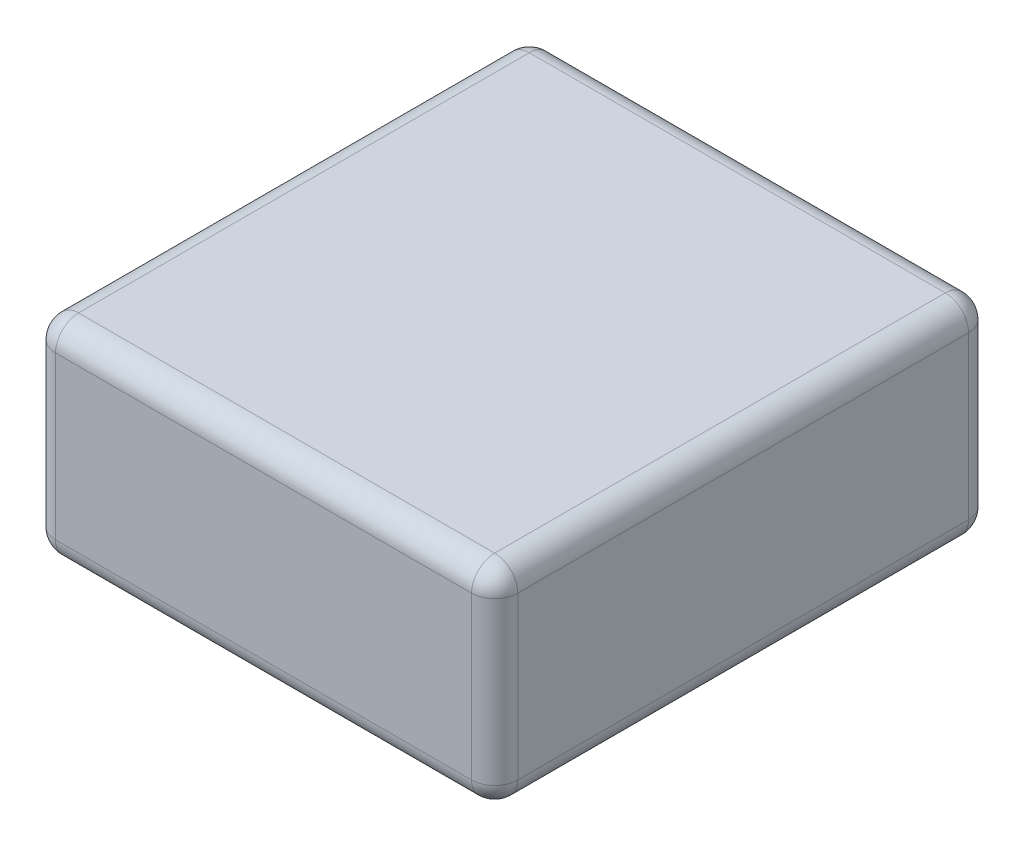
ISO-10303-21;
HEADER;
FILE_DESCRIPTION(('STEP AP214'),'2;1');
FILE_NAME('part.step','',(''),(''),'','','');
FILE_SCHEMA(('AUTOMOTIVE_DESIGN { 1 0 10303 214 1 1 1 1 }'));
ENDSEC;
DATA;
#1=APPLICATION_CONTEXT('core data for automotive mechanical design processes');
#2=APPLICATION_PROTOCOL_DEFINITION('international standard','automotive_design',2000,#1);
#3=PRODUCT_CONTEXT('',#1,'mechanical');
#4=PRODUCT('Part','Part','',(#3));
#5=PRODUCT_RELATED_PRODUCT_CATEGORY('part','',(#4));
#6=PRODUCT_DEFINITION_FORMATION('','',#4);
#7=PRODUCT_DEFINITION_CONTEXT('part definition',#1,'design');
#8=PRODUCT_DEFINITION('design','',#6,#7);
#9=PRODUCT_DEFINITION_SHAPE('','',#8);
#10=(LENGTH_UNIT() NAMED_UNIT(*) SI_UNIT(.MILLI.,.METRE.));
#11=(NAMED_UNIT(*) PLANE_ANGLE_UNIT() SI_UNIT($,.RADIAN.));
#12=(NAMED_UNIT(*) SI_UNIT($,.STERADIAN.) SOLID_ANGLE_UNIT());
#13=UNCERTAINTY_MEASURE_WITH_UNIT(LENGTH_MEASURE(1.E-05),#10,'distance_accuracy_value','');
#14=(GEOMETRIC_REPRESENTATION_CONTEXT(3) GLOBAL_UNCERTAINTY_ASSIGNED_CONTEXT((#13)) GLOBAL_UNIT_ASSIGNED_CONTEXT((#10,
#11,#12)) REPRESENTATION_CONTEXT('',''));
#15=CARTESIAN_POINT('',(0.,0.,0.));
#16=DIRECTION('',(0.,0.,1.));
#17=DIRECTION('',(1.,0.,0.));
#18=AXIS2_PLACEMENT_3D('',#15,#16,#17);
#19=CARTESIAN_POINT('',(100.,45.,-215.));
#20=DIRECTION('',(1.,0.,0.));
#21=DIRECTION('',(0.,0.,-1.));
#22=AXIS2_PLACEMENT_3D('',#19,#20,#21);
#23=PLANE('',#22);
#24=DIRECTION('',(0.,0.,1.));
#25=VECTOR('',#24,1.);
#26=CARTESIAN_POINT('',(100.,-35.,-215.));
#27=LINE('',#26,#25);
#28=CARTESIAN_POINT('',(100.,-35.,-10.));
#29=VERTEX_POINT('',#28);
#30=CARTESIAN_POINT('',(100.,-35.,-205.));
#31=VERTEX_POINT('',#30);
#32=EDGE_CURVE('E161',#29,#31,#27,.F.);
#33=ORIENTED_EDGE('',*,*,#32,.T.);
#34=DIRECTION('',(0.,1.,0.));
#35=VECTOR('',#34,1.);
#36=CARTESIAN_POINT('',(100.,45.,-205.));
#37=LINE('',#36,#35);
#38=CARTESIAN_POINT('',(100.,35.,-205.));
#39=VERTEX_POINT('',#38);
#40=EDGE_CURVE('E298',#31,#39,#37,.T.);
#41=ORIENTED_EDGE('',*,*,#40,.T.);
#42=DIRECTION('',(0.,0.,1.));
#43=VECTOR('',#42,1.);
#44=CARTESIAN_POINT('',(100.,35.,-215.));
#45=LINE('',#44,#43);
#46=CARTESIAN_POINT('',(100.,35.,-10.));
#47=VERTEX_POINT('',#46);
#48=EDGE_CURVE('E290',#39,#47,#45,.T.);
#49=ORIENTED_EDGE('',*,*,#48,.T.);
#50=DIRECTION('',(0.,1.,0.));
#51=VECTOR('',#50,1.);
#52=CARTESIAN_POINT('',(100.,45.,-10.));
#53=LINE('',#52,#51);
#54=EDGE_CURVE('E292',#47,#29,#53,.F.);
#55=ORIENTED_EDGE('',*,*,#54,.T.);
#56=EDGE_LOOP('',(#33,#41,#49,#55));
#57=FACE_BOUND('',#56,.T.);
#58=ADVANCED_FACE('F41',(#57),#23,.T.);
#59=CARTESIAN_POINT('',(-100.,-45.,-215.));
#60=DIRECTION('',(0.,-1.,0.));
#61=DIRECTION('',(0.,0.,-1.));
#62=AXIS2_PLACEMENT_3D('',#59,#60,#61);
#63=PLANE('',#62);
#64=DIRECTION('',(0.,0.,1.));
#65=VECTOR('',#64,1.);
#66=CARTESIAN_POINT('',(-90.,-45.,-215.));
#67=LINE('',#66,#65);
#68=CARTESIAN_POINT('',(-90.,-45.,-10.));
#69=VERTEX_POINT('',#68);
#70=CARTESIAN_POINT('',(-90.,-45.,-205.));
#71=VERTEX_POINT('',#70);
#72=EDGE_CURVE('E139',#69,#71,#67,.F.);
#73=ORIENTED_EDGE('',*,*,#72,.T.);
#74=DIRECTION('',(1.,0.,0.));
#75=VECTOR('',#74,1.);
#76=CARTESIAN_POINT('',(100.,-45.,-205.));
#77=LINE('',#76,#75);
#78=CARTESIAN_POINT('',(90.,-45.,-205.));
#79=VERTEX_POINT('',#78);
#80=EDGE_CURVE('E135',#71,#79,#77,.T.);
#81=ORIENTED_EDGE('',*,*,#80,.T.);
#82=DIRECTION('',(0.,0.,1.));
#83=VECTOR('',#82,1.);
#84=CARTESIAN_POINT('',(90.,-45.,-215.));
#85=LINE('',#84,#83);
#86=CARTESIAN_POINT('',(90.,-45.,-10.));
#87=VERTEX_POINT('',#86);
#88=EDGE_CURVE('E129',#79,#87,#85,.T.);
#89=ORIENTED_EDGE('',*,*,#88,.T.);
#90=DIRECTION('',(1.,0.,0.));
#91=VECTOR('',#90,1.);
#92=CARTESIAN_POINT('',(-100.,-45.,-10.));
#93=LINE('',#92,#91);
#94=EDGE_CURVE('E132',#87,#69,#93,.F.);
#95=ORIENTED_EDGE('',*,*,#94,.T.);
#96=EDGE_LOOP('',(#73,#81,#89,#95));
#97=FACE_BOUND('',#96,.T.);
#98=ADVANCED_FACE('F131',(#97),#63,.T.);
#99=CARTESIAN_POINT('',(-100.,45.,-215.));
#100=DIRECTION('',(-1.,0.,0.));
#101=DIRECTION('',(0.,-1.,0.));
#102=AXIS2_PLACEMENT_3D('',#99,#100,#101);
#103=PLANE('',#102);
#104=DIRECTION('',(0.,-1.,0.));
#105=VECTOR('',#104,1.);
#106=CARTESIAN_POINT('',(-100.,-45.,-205.));
#107=LINE('',#106,#105);
#108=CARTESIAN_POINT('',(-100.,35.,-205.));
#109=VERTEX_POINT('',#108);
#110=CARTESIAN_POINT('',(-100.,-35.,-205.));
#111=VERTEX_POINT('',#110);
#112=EDGE_CURVE('E238',#109,#111,#107,.T.);
#113=ORIENTED_EDGE('',*,*,#112,.T.);
#114=DIRECTION('',(0.,0.,1.));
#115=VECTOR('',#114,1.);
#116=CARTESIAN_POINT('',(-100.,-35.,-215.));
#117=LINE('',#116,#115);
#118=CARTESIAN_POINT('',(-100.,-35.,-10.));
#119=VERTEX_POINT('',#118);
#120=EDGE_CURVE('E245',#111,#119,#117,.T.);
#121=ORIENTED_EDGE('',*,*,#120,.T.);
#122=DIRECTION('',(0.,-1.,0.));
#123=VECTOR('',#122,1.);
#124=CARTESIAN_POINT('',(-100.,45.,-10.));
#125=LINE('',#124,#123);
#126=CARTESIAN_POINT('',(-100.,35.,-10.));
#127=VERTEX_POINT('',#126);
#128=EDGE_CURVE('E246',#119,#127,#125,.F.);
#129=ORIENTED_EDGE('',*,*,#128,.T.);
#130=DIRECTION('',(0.,0.,1.));
#131=VECTOR('',#130,1.);
#132=CARTESIAN_POINT('',(-100.,35.,-215.));
#133=LINE('',#132,#131);
#134=EDGE_CURVE('E250',#127,#109,#133,.F.);
#135=ORIENTED_EDGE('',*,*,#134,.T.);
#136=EDGE_LOOP('',(#113,#121,#129,#135));
#137=FACE_BOUND('',#136,.T.);
#138=ADVANCED_FACE('F300',(#137),#103,.T.);
#139=CARTESIAN_POINT('',(-100.,45.,-215.));
#140=DIRECTION('',(0.,1.,0.));
#141=DIRECTION('',(0.,0.,1.));
#142=AXIS2_PLACEMENT_3D('',#139,#140,#141);
#143=PLANE('',#142);
#144=DIRECTION('',(-1.,0.,0.));
#145=VECTOR('',#144,1.);
#146=CARTESIAN_POINT('',(-100.,45.,-205.));
#147=LINE('',#146,#145);
#148=CARTESIAN_POINT('',(90.,45.,-205.));
#149=VERTEX_POINT('',#148);
#150=CARTESIAN_POINT('',(-90.,45.,-205.));
#151=VERTEX_POINT('',#150);
#152=EDGE_CURVE('E50',#149,#151,#147,.T.);
#153=ORIENTED_EDGE('',*,*,#152,.T.);
#154=DIRECTION('',(0.,0.,1.));
#155=VECTOR('',#154,1.);
#156=CARTESIAN_POINT('',(-90.,45.,-215.));
#157=LINE('',#156,#155);
#158=CARTESIAN_POINT('',(-90.,45.,-10.));
#159=VERTEX_POINT('',#158);
#160=EDGE_CURVE('E11',#151,#159,#157,.T.);
#161=ORIENTED_EDGE('',*,*,#160,.T.);
#162=DIRECTION('',(-1.,0.,0.));
#163=VECTOR('',#162,1.);
#164=CARTESIAN_POINT('',(-100.,45.,-10.));
#165=LINE('',#164,#163);
#166=CARTESIAN_POINT('',(90.,45.,-10.));
#167=VERTEX_POINT('',#166);
#168=EDGE_CURVE('E217',#159,#167,#165,.F.);
#169=ORIENTED_EDGE('',*,*,#168,.T.);
#170=DIRECTION('',(0.,0.,1.));
#171=VECTOR('',#170,1.);
#172=CARTESIAN_POINT('',(90.,45.,-215.));
#173=LINE('',#172,#171);
#174=EDGE_CURVE('E61',#167,#149,#173,.F.);
#175=ORIENTED_EDGE('',*,*,#174,.T.);
#176=EDGE_LOOP('',(#153,#161,#169,#175));
#177=FACE_BOUND('',#176,.T.);
#178=ADVANCED_FACE('F220',(#177),#143,.T.);
#179=CARTESIAN_POINT('',(0.,0.,-215.));
#180=DIRECTION('',(0.,0.,1.));
#181=DIRECTION('',(1.,0.,0.));
#182=AXIS2_PLACEMENT_3D('',#179,#180,#181);
#183=PLANE('',#182);
#184=DIRECTION('',(0.,1.,0.));
#185=VECTOR('',#184,1.);
#186=CARTESIAN_POINT('',(90.,-45.,-215.));
#187=LINE('',#186,#185);
#188=CARTESIAN_POINT('',(90.,35.,-215.));
#189=VERTEX_POINT('',#188);
#190=CARTESIAN_POINT('',(90.,-35.,-215.));
#191=VERTEX_POINT('',#190);
#192=EDGE_CURVE('E281',#189,#191,#187,.F.);
#193=ORIENTED_EDGE('',*,*,#192,.T.);
#194=DIRECTION('',(1.,0.,0.));
#195=VECTOR('',#194,1.);
#196=CARTESIAN_POINT('',(-100.,-35.,-215.));
#197=LINE('',#196,#195);
#198=CARTESIAN_POINT('',(-90.,-35.,-215.));
#199=VERTEX_POINT('',#198);
#200=EDGE_CURVE('E284',#191,#199,#197,.F.);
#201=ORIENTED_EDGE('',*,*,#200,.T.);
#202=DIRECTION('',(0.,-1.,0.));
#203=VECTOR('',#202,1.);
#204=CARTESIAN_POINT('',(-90.,45.,-215.));
#205=LINE('',#204,#203);
#206=CARTESIAN_POINT('',(-90.,35.,-215.));
#207=VERTEX_POINT('',#206);
#208=EDGE_CURVE('E278',#199,#207,#205,.F.);
#209=ORIENTED_EDGE('',*,*,#208,.T.);
#210=DIRECTION('',(-1.,0.,0.));
#211=VECTOR('',#210,1.);
#212=CARTESIAN_POINT('',(100.,35.,-215.));
#213=LINE('',#212,#211);
#214=EDGE_CURVE('E231',#207,#189,#213,.F.);
#215=ORIENTED_EDGE('',*,*,#214,.T.);
#216=EDGE_LOOP('',(#193,#201,#209,#215));
#217=FACE_BOUND('',#216,.T.);
#218=ADVANCED_FACE('F285',(#217),#183,.F.);
#219=CARTESIAN_POINT('',(0.,0.,0.));
#220=DIRECTION('',(0.,0.,1.));
#221=DIRECTION('',(1.,0.,0.));
#222=AXIS2_PLACEMENT_3D('',#219,#220,#221);
#223=PLANE('',#222);
#224=DIRECTION('',(0.,-1.,0.));
#225=VECTOR('',#224,1.);
#226=CARTESIAN_POINT('',(-90.,0.,0.));
#227=LINE('',#226,#225);
#228=CARTESIAN_POINT('',(-90.,35.,0.));
#229=VERTEX_POINT('',#228);
#230=CARTESIAN_POINT('',(-90.,-35.,0.));
#231=VERTEX_POINT('',#230);
#232=EDGE_CURVE('E257',#229,#231,#227,.T.);
#233=ORIENTED_EDGE('',*,*,#232,.T.);
#234=DIRECTION('',(1.,0.,0.));
#235=VECTOR('',#234,1.);
#236=CARTESIAN_POINT('',(0.,-35.,0.));
#237=LINE('',#236,#235);
#238=CARTESIAN_POINT('',(90.,-35.,0.));
#239=VERTEX_POINT('',#238);
#240=EDGE_CURVE('E218',#231,#239,#237,.T.);
#241=ORIENTED_EDGE('',*,*,#240,.T.);
#242=DIRECTION('',(0.,1.,0.));
#243=VECTOR('',#242,1.);
#244=CARTESIAN_POINT('',(90.,0.,0.));
#245=LINE('',#244,#243);
#246=CARTESIAN_POINT('',(90.,35.,0.));
#247=VERTEX_POINT('',#246);
#248=EDGE_CURVE('E255',#239,#247,#245,.T.);
#249=ORIENTED_EDGE('',*,*,#248,.T.);
#250=DIRECTION('',(-1.,0.,0.));
#251=VECTOR('',#250,1.);
#252=CARTESIAN_POINT('',(0.,35.,0.));
#253=LINE('',#252,#251);
#254=EDGE_CURVE('E248',#247,#229,#253,.T.);
#255=ORIENTED_EDGE('',*,*,#254,.T.);
#256=EDGE_LOOP('',(#233,#241,#249,#255));
#257=FACE_BOUND('',#256,.T.);
#258=ADVANCED_FACE('F306',(#257),#223,.T.);
#259=CARTESIAN_POINT('',(0.,35.,-10.));
#260=DIRECTION('',(-1.,0.,0.));
#261=DIRECTION('',(0.,0.,1.));
#262=AXIS2_PLACEMENT_3D('',#259,#260,#261);
#263=CYLINDRICAL_SURFACE('',#262,10.);
#264=CARTESIAN_POINT('',(-90.,35.,-10.));
#265=DIRECTION('',(-1.,0.,0.));
#266=DIRECTION('',(0.,0.,1.));
#267=AXIS2_PLACEMENT_3D('',#264,#265,#266);
#268=CIRCLE('',#267,10.);
#269=EDGE_CURVE('E45',#229,#159,#268,.T.);
#270=ORIENTED_EDGE('',*,*,#269,.F.);
#271=ORIENTED_EDGE('',*,*,#254,.F.);
#272=CARTESIAN_POINT('',(90.,35.,-10.));
#273=DIRECTION('',(1.,0.,0.));
#274=DIRECTION('',(0.,0.,-1.));
#275=AXIS2_PLACEMENT_3D('',#272,#273,#274);
#276=CIRCLE('',#275,10.);
#277=EDGE_CURVE('E200',#167,#247,#276,.T.);
#278=ORIENTED_EDGE('',*,*,#277,.F.);
#279=ORIENTED_EDGE('',*,*,#168,.F.);
#280=EDGE_LOOP('',(#270,#271,#278,#279));
#281=FACE_BOUND('',#280,.T.);
#282=ADVANCED_FACE('F43',(#281),#263,.T.);
#283=CARTESIAN_POINT('',(-90.,35.,-10.));
#284=DIRECTION('',(0.,1.,0.));
#285=DIRECTION('',(0.,0.,1.));
#286=AXIS2_PLACEMENT_3D('',#283,#284,#285);
#287=SPHERICAL_SURFACE('',#286,10.);
#288=CARTESIAN_POINT('',(-90.,35.,-10.));
#289=DIRECTION('',(0.,1.,0.));
#290=DIRECTION('',(0.,0.,1.));
#291=AXIS2_PLACEMENT_3D('',#288,#289,#290);
#292=CIRCLE('',#291,10.);
#293=EDGE_CURVE('E196',#229,#127,#292,.F.);
#294=ORIENTED_EDGE('',*,*,#293,.F.);
#295=ORIENTED_EDGE('',*,*,#269,.T.);
#296=CARTESIAN_POINT('',(-90.,35.,-10.));
#297=DIRECTION('',(0.,0.,1.));
#298=DIRECTION('',(1.,0.,0.));
#299=AXIS2_PLACEMENT_3D('',#296,#297,#298);
#300=CIRCLE('',#299,10.);
#301=EDGE_CURVE('E199',#127,#159,#300,.F.);
#302=ORIENTED_EDGE('',*,*,#301,.F.);
#303=EDGE_LOOP('',(#294,#295,#302));
#304=FACE_BOUND('',#303,.T.);
#305=ADVANCED_FACE('F212',(#304),#287,.T.);
#306=CARTESIAN_POINT('',(90.,35.,-10.));
#307=DIRECTION('',(0.,0.,1.));
#308=DIRECTION('',(1.,0.,0.));
#309=AXIS2_PLACEMENT_3D('',#306,#307,#308);
#310=SPHERICAL_SURFACE('',#309,10.);
#311=CARTESIAN_POINT('',(90.,35.,-10.));
#312=DIRECTION('',(0.,0.,1.));
#313=DIRECTION('',(1.,0.,0.));
#314=AXIS2_PLACEMENT_3D('',#311,#312,#313);
#315=CIRCLE('',#314,10.);
#316=EDGE_CURVE('E190',#167,#47,#315,.F.);
#317=ORIENTED_EDGE('',*,*,#316,.F.);
#318=ORIENTED_EDGE('',*,*,#277,.T.);
#319=CARTESIAN_POINT('',(90.,35.,-10.));
#320=DIRECTION('',(0.,1.,0.));
#321=DIRECTION('',(0.,0.,1.));
#322=AXIS2_PLACEMENT_3D('',#319,#320,#321);
#323=CIRCLE('',#322,10.);
#324=EDGE_CURVE('E193',#47,#247,#323,.F.);
#325=ORIENTED_EDGE('',*,*,#324,.F.);
#326=EDGE_LOOP('',(#317,#318,#325));
#327=FACE_BOUND('',#326,.T.);
#328=ADVANCED_FACE('F310',(#327),#310,.T.);
#329=CARTESIAN_POINT('',(-90.,35.,-215.));
#330=DIRECTION('',(0.,0.,1.));
#331=DIRECTION('',(1.,0.,0.));
#332=AXIS2_PLACEMENT_3D('',#329,#330,#331);
#333=CYLINDRICAL_SURFACE('',#332,10.);
#334=ORIENTED_EDGE('',*,*,#301,.T.);
#335=ORIENTED_EDGE('',*,*,#160,.F.);
#336=CARTESIAN_POINT('',(-90.,35.,-205.));
#337=DIRECTION('',(0.,0.,-1.));
#338=DIRECTION('',(-1.,0.,0.));
#339=AXIS2_PLACEMENT_3D('',#336,#337,#338);
#340=CIRCLE('',#339,10.);
#341=EDGE_CURVE('E184',#109,#151,#340,.T.);
#342=ORIENTED_EDGE('',*,*,#341,.F.);
#343=ORIENTED_EDGE('',*,*,#134,.F.);
#344=EDGE_LOOP('',(#334,#335,#342,#343));
#345=FACE_BOUND('',#344,.T.);
#346=ADVANCED_FACE('F224',(#345),#333,.T.);
#347=CARTESIAN_POINT('',(-90.,0.,-10.));
#348=DIRECTION('',(0.,-1.,0.));
#349=DIRECTION('',(1.,0.,0.));
#350=AXIS2_PLACEMENT_3D('',#347,#348,#349);
#351=CYLINDRICAL_SURFACE('',#350,10.);
#352=ORIENTED_EDGE('',*,*,#293,.T.);
#353=ORIENTED_EDGE('',*,*,#128,.F.);
#354=CARTESIAN_POINT('',(-90.,-35.,-10.));
#355=DIRECTION('',(0.,-1.,0.));
#356=DIRECTION('',(1.,0.,0.));
#357=AXIS2_PLACEMENT_3D('',#354,#355,#356);
#358=CIRCLE('',#357,10.);
#359=EDGE_CURVE('E181',#231,#119,#358,.T.);
#360=ORIENTED_EDGE('',*,*,#359,.F.);
#361=ORIENTED_EDGE('',*,*,#232,.F.);
#362=EDGE_LOOP('',(#352,#353,#360,#361));
#363=FACE_BOUND('',#362,.T.);
#364=ADVANCED_FACE('F304',(#363),#351,.T.);
#365=CARTESIAN_POINT('',(0.,-35.,-10.));
#366=DIRECTION('',(1.,0.,0.));
#367=DIRECTION('',(0.,0.,-1.));
#368=AXIS2_PLACEMENT_3D('',#365,#366,#367);
#369=CYLINDRICAL_SURFACE('',#368,10.);
#370=CARTESIAN_POINT('',(90.,-35.,-10.));
#371=DIRECTION('',(1.,0.,0.));
#372=DIRECTION('',(0.,1.,0.));
#373=AXIS2_PLACEMENT_3D('',#370,#371,#372);
#374=CIRCLE('',#373,10.);
#375=EDGE_CURVE('E146',#239,#87,#374,.T.);
#376=ORIENTED_EDGE('',*,*,#375,.F.);
#377=ORIENTED_EDGE('',*,*,#240,.F.);
#378=CARTESIAN_POINT('',(-90.,-35.,-10.));
#379=DIRECTION('',(-1.,0.,0.));
#380=DIRECTION('',(0.,0.,1.));
#381=AXIS2_PLACEMENT_3D('',#378,#379,#380);
#382=CIRCLE('',#381,10.);
#383=EDGE_CURVE('E149',#69,#231,#382,.T.);
#384=ORIENTED_EDGE('',*,*,#383,.F.);
#385=ORIENTED_EDGE('',*,*,#94,.F.);
#386=EDGE_LOOP('',(#376,#377,#384,#385));
#387=FACE_BOUND('',#386,.T.);
#388=ADVANCED_FACE('F144',(#387),#369,.T.);
#389=CARTESIAN_POINT('',(90.,0.,-10.));
#390=DIRECTION('',(0.,1.,0.));
#391=DIRECTION('',(0.,0.,1.));
#392=AXIS2_PLACEMENT_3D('',#389,#390,#391);
#393=CYLINDRICAL_SURFACE('',#392,10.);
#394=ORIENTED_EDGE('',*,*,#324,.T.);
#395=ORIENTED_EDGE('',*,*,#248,.F.);
#396=CARTESIAN_POINT('',(90.,-35.,-10.));
#397=DIRECTION('',(0.,-1.,0.));
#398=DIRECTION('',(0.,0.,-1.));
#399=AXIS2_PLACEMENT_3D('',#396,#397,#398);
#400=CIRCLE('',#399,10.);
#401=EDGE_CURVE('E158',#29,#239,#400,.T.);
#402=ORIENTED_EDGE('',*,*,#401,.F.);
#403=ORIENTED_EDGE('',*,*,#54,.F.);
#404=EDGE_LOOP('',(#394,#395,#402,#403));
#405=FACE_BOUND('',#404,.T.);
#406=ADVANCED_FACE('F308',(#405),#393,.T.);
#407=CARTESIAN_POINT('',(90.,35.,-215.));
#408=DIRECTION('',(0.,0.,1.));
#409=DIRECTION('',(1.,0.,0.));
#410=AXIS2_PLACEMENT_3D('',#407,#408,#409);
#411=CYLINDRICAL_SURFACE('',#410,10.);
#412=ORIENTED_EDGE('',*,*,#316,.T.);
#413=ORIENTED_EDGE('',*,*,#48,.F.);
#414=CARTESIAN_POINT('',(90.,35.,-205.));
#415=DIRECTION('',(0.,0.,-1.));
#416=DIRECTION('',(-1.,0.,0.));
#417=AXIS2_PLACEMENT_3D('',#414,#415,#416);
#418=CIRCLE('',#417,10.);
#419=EDGE_CURVE('E176',#149,#39,#418,.T.);
#420=ORIENTED_EDGE('',*,*,#419,.F.);
#421=ORIENTED_EDGE('',*,*,#174,.F.);
#422=EDGE_LOOP('',(#412,#413,#420,#421));
#423=FACE_BOUND('',#422,.T.);
#424=ADVANCED_FACE('F313',(#423),#411,.T.);
#425=CARTESIAN_POINT('',(-100.,35.,-205.));
#426=DIRECTION('',(1.,0.,0.));
#427=DIRECTION('',(0.,0.,-1.));
#428=AXIS2_PLACEMENT_3D('',#425,#426,#427);
#429=CYLINDRICAL_SURFACE('',#428,10.);
#430=CARTESIAN_POINT('',(-90.,35.,-205.));
#431=DIRECTION('',(-1.,0.,0.));
#432=DIRECTION('',(0.,0.,1.));
#433=AXIS2_PLACEMENT_3D('',#430,#431,#432);
#434=CIRCLE('',#433,10.);
#435=EDGE_CURVE('E187',#151,#207,#434,.T.);
#436=ORIENTED_EDGE('',*,*,#435,.F.);
#437=ORIENTED_EDGE('',*,*,#152,.F.);
#438=CARTESIAN_POINT('',(90.,35.,-205.));
#439=DIRECTION('',(1.,0.,0.));
#440=DIRECTION('',(0.,0.,-1.));
#441=AXIS2_PLACEMENT_3D('',#438,#439,#440);
#442=CIRCLE('',#441,10.);
#443=EDGE_CURVE('E173',#189,#149,#442,.T.);
#444=ORIENTED_EDGE('',*,*,#443,.F.);
#445=ORIENTED_EDGE('',*,*,#214,.F.);
#446=EDGE_LOOP('',(#436,#437,#444,#445));
#447=FACE_BOUND('',#446,.T.);
#448=ADVANCED_FACE('F228',(#447),#429,.T.);
#449=CARTESIAN_POINT('',(-90.,35.,-205.));
#450=DIRECTION('',(0.,1.,0.));
#451=DIRECTION('',(0.,0.,1.));
#452=AXIS2_PLACEMENT_3D('',#449,#450,#451);
#453=SPHERICAL_SURFACE('',#452,10.);
#454=ORIENTED_EDGE('',*,*,#341,.T.);
#455=ORIENTED_EDGE('',*,*,#435,.T.);
#456=CARTESIAN_POINT('',(-90.,35.,-205.));
#457=DIRECTION('',(0.,1.,0.));
#458=DIRECTION('',(0.,0.,1.));
#459=AXIS2_PLACEMENT_3D('',#456,#457,#458);
#460=CIRCLE('',#459,10.);
#461=EDGE_CURVE('E165',#109,#207,#460,.F.);
#462=ORIENTED_EDGE('',*,*,#461,.F.);
#463=EDGE_LOOP('',(#454,#455,#462));
#464=FACE_BOUND('',#463,.T.);
#465=ADVANCED_FACE('F233',(#464),#453,.T.);
#466=CARTESIAN_POINT('',(-90.,-35.,-10.));
#467=DIRECTION('',(0.,0.,1.));
#468=DIRECTION('',(1.,0.,0.));
#469=AXIS2_PLACEMENT_3D('',#466,#467,#468);
#470=SPHERICAL_SURFACE('',#469,10.);
#471=ORIENTED_EDGE('',*,*,#383,.T.);
#472=ORIENTED_EDGE('',*,*,#359,.T.);
#473=CARTESIAN_POINT('',(-90.,-35.,-10.));
#474=DIRECTION('',(0.,0.,1.));
#475=DIRECTION('',(1.,0.,0.));
#476=AXIS2_PLACEMENT_3D('',#473,#474,#475);
#477=CIRCLE('',#476,10.);
#478=EDGE_CURVE('E162',#69,#119,#477,.F.);
#479=ORIENTED_EDGE('',*,*,#478,.F.);
#480=EDGE_LOOP('',(#471,#472,#479));
#481=FACE_BOUND('',#480,.T.);
#482=ADVANCED_FACE('F330',(#481),#470,.T.);
#483=CARTESIAN_POINT('',(90.,-35.,-10.));
#484=DIRECTION('',(0.,0.,1.));
#485=DIRECTION('',(1.,0.,0.));
#486=AXIS2_PLACEMENT_3D('',#483,#484,#485);
#487=SPHERICAL_SURFACE('',#486,10.);
#488=ORIENTED_EDGE('',*,*,#401,.T.);
#489=ORIENTED_EDGE('',*,*,#375,.T.);
#490=CARTESIAN_POINT('',(90.,-35.,-10.));
#491=DIRECTION('',(0.,0.,1.));
#492=DIRECTION('',(1.,0.,0.));
#493=AXIS2_PLACEMENT_3D('',#490,#491,#492);
#494=CIRCLE('',#493,10.);
#495=EDGE_CURVE('E155',#29,#87,#494,.F.);
#496=ORIENTED_EDGE('',*,*,#495,.F.);
#497=EDGE_LOOP('',(#488,#489,#496));
#498=FACE_BOUND('',#497,.T.);
#499=ADVANCED_FACE('F154',(#498),#487,.T.);
#500=CARTESIAN_POINT('',(90.,35.,-205.));
#501=DIRECTION('',(0.,1.,0.));
#502=DIRECTION('',(0.,0.,1.));
#503=AXIS2_PLACEMENT_3D('',#500,#501,#502);
#504=SPHERICAL_SURFACE('',#503,10.);
#505=ORIENTED_EDGE('',*,*,#443,.T.);
#506=ORIENTED_EDGE('',*,*,#419,.T.);
#507=CARTESIAN_POINT('',(90.,35.,-205.));
#508=DIRECTION('',(0.,1.,0.));
#509=DIRECTION('',(0.,0.,1.));
#510=AXIS2_PLACEMENT_3D('',#507,#508,#509);
#511=CIRCLE('',#510,10.);
#512=EDGE_CURVE('E163',#189,#39,#511,.F.);
#513=ORIENTED_EDGE('',*,*,#512,.F.);
#514=EDGE_LOOP('',(#505,#506,#513));
#515=FACE_BOUND('',#514,.T.);
#516=ADVANCED_FACE('F316',(#515),#504,.T.);
#517=CARTESIAN_POINT('',(-90.,45.,-205.));
#518=DIRECTION('',(0.,1.,0.));
#519=DIRECTION('',(-1.,0.,0.));
#520=AXIS2_PLACEMENT_3D('',#517,#518,#519);
#521=CYLINDRICAL_SURFACE('',#520,10.);
#522=ORIENTED_EDGE('',*,*,#461,.T.);
#523=ORIENTED_EDGE('',*,*,#208,.F.);
#524=CARTESIAN_POINT('',(-90.,-35.,-205.));
#525=DIRECTION('',(0.,-1.,0.));
#526=DIRECTION('',(0.,0.,-1.));
#527=AXIS2_PLACEMENT_3D('',#524,#525,#526);
#528=CIRCLE('',#527,10.);
#529=EDGE_CURVE('E167',#111,#199,#528,.T.);
#530=ORIENTED_EDGE('',*,*,#529,.F.);
#531=ORIENTED_EDGE('',*,*,#112,.F.);
#532=EDGE_LOOP('',(#522,#523,#530,#531));
#533=FACE_BOUND('',#532,.T.);
#534=ADVANCED_FACE('F239',(#533),#521,.T.);
#535=CARTESIAN_POINT('',(-90.,-35.,-215.));
#536=DIRECTION('',(0.,0.,1.));
#537=DIRECTION('',(1.,0.,0.));
#538=AXIS2_PLACEMENT_3D('',#535,#536,#537);
#539=CYLINDRICAL_SURFACE('',#538,10.);
#540=ORIENTED_EDGE('',*,*,#478,.T.);
#541=ORIENTED_EDGE('',*,*,#120,.F.);
#542=CARTESIAN_POINT('',(-90.,-35.,-205.));
#543=DIRECTION('',(0.,0.,-1.));
#544=DIRECTION('',(-1.,0.,0.));
#545=AXIS2_PLACEMENT_3D('',#542,#543,#544);
#546=CIRCLE('',#545,10.);
#547=EDGE_CURVE('E273',#71,#111,#546,.T.);
#548=ORIENTED_EDGE('',*,*,#547,.F.);
#549=ORIENTED_EDGE('',*,*,#72,.F.);
#550=EDGE_LOOP('',(#540,#541,#548,#549));
#551=FACE_BOUND('',#550,.T.);
#552=ADVANCED_FACE('F328',(#551),#539,.T.);
#553=CARTESIAN_POINT('',(90.,-35.,-215.));
#554=DIRECTION('',(0.,0.,1.));
#555=DIRECTION('',(1.,0.,0.));
#556=AXIS2_PLACEMENT_3D('',#553,#554,#555);
#557=CYLINDRICAL_SURFACE('',#556,10.);
#558=ORIENTED_EDGE('',*,*,#495,.T.);
#559=ORIENTED_EDGE('',*,*,#88,.F.);
#560=CARTESIAN_POINT('',(90.,-35.,-205.));
#561=DIRECTION('',(0.,0.,-1.));
#562=DIRECTION('',(-1.,0.,0.));
#563=AXIS2_PLACEMENT_3D('',#560,#561,#562);
#564=CIRCLE('',#563,10.);
#565=EDGE_CURVE('E270',#31,#79,#564,.T.);
#566=ORIENTED_EDGE('',*,*,#565,.F.);
#567=ORIENTED_EDGE('',*,*,#32,.F.);
#568=EDGE_LOOP('',(#558,#559,#566,#567));
#569=FACE_BOUND('',#568,.T.);
#570=ADVANCED_FACE('F160',(#569),#557,.T.);
#571=CARTESIAN_POINT('',(90.,45.,-205.));
#572=DIRECTION('',(0.,-1.,0.));
#573=DIRECTION('',(0.,0.,-1.));
#574=AXIS2_PLACEMENT_3D('',#571,#572,#573);
#575=CYLINDRICAL_SURFACE('',#574,10.);
#576=ORIENTED_EDGE('',*,*,#512,.T.);
#577=ORIENTED_EDGE('',*,*,#40,.F.);
#578=CARTESIAN_POINT('',(90.,-35.,-205.));
#579=DIRECTION('',(0.,-1.,0.));
#580=DIRECTION('',(0.,0.,-1.));
#581=AXIS2_PLACEMENT_3D('',#578,#579,#580);
#582=CIRCLE('',#581,10.);
#583=EDGE_CURVE('E267',#191,#31,#582,.T.);
#584=ORIENTED_EDGE('',*,*,#583,.F.);
#585=ORIENTED_EDGE('',*,*,#192,.F.);
#586=EDGE_LOOP('',(#576,#577,#584,#585));
#587=FACE_BOUND('',#586,.T.);
#588=ADVANCED_FACE('F319',(#587),#575,.T.);
#589=CARTESIAN_POINT('',(-90.,-35.,-205.));
#590=DIRECTION('',(-1.,0.,0.));
#591=DIRECTION('',(0.,-1.,0.));
#592=AXIS2_PLACEMENT_3D('',#589,#590,#591);
#593=SPHERICAL_SURFACE('',#592,10.);
#594=ORIENTED_EDGE('',*,*,#547,.T.);
#595=ORIENTED_EDGE('',*,*,#529,.T.);
#596=CARTESIAN_POINT('',(-90.,-35.,-205.));
#597=DIRECTION('',(-1.,0.,0.));
#598=DIRECTION('',(0.,0.,1.));
#599=AXIS2_PLACEMENT_3D('',#596,#597,#598);
#600=CIRCLE('',#599,10.);
#601=EDGE_CURVE('E265',#71,#199,#600,.F.);
#602=ORIENTED_EDGE('',*,*,#601,.F.);
#603=EDGE_LOOP('',(#594,#595,#602));
#604=FACE_BOUND('',#603,.T.);
#605=ADVANCED_FACE('F276',(#604),#593,.T.);
#606=CARTESIAN_POINT('',(90.,-35.,-205.));
#607=DIRECTION('',(1.,0.,0.));
#608=DIRECTION('',(0.,0.,-1.));
#609=AXIS2_PLACEMENT_3D('',#606,#607,#608);
#610=SPHERICAL_SURFACE('',#609,10.);
#611=ORIENTED_EDGE('',*,*,#583,.T.);
#612=ORIENTED_EDGE('',*,*,#565,.T.);
#613=CARTESIAN_POINT('',(90.,-35.,-205.));
#614=DIRECTION('',(1.,0.,0.));
#615=DIRECTION('',(0.,0.,-1.));
#616=AXIS2_PLACEMENT_3D('',#613,#614,#615);
#617=CIRCLE('',#616,10.);
#618=EDGE_CURVE('E263',#191,#79,#617,.F.);
#619=ORIENTED_EDGE('',*,*,#618,.F.);
#620=EDGE_LOOP('',(#611,#612,#619));
#621=FACE_BOUND('',#620,.T.);
#622=ADVANCED_FACE('F321',(#621),#610,.T.);
#623=CARTESIAN_POINT('',(-100.,-35.,-205.));
#624=DIRECTION('',(-1.,0.,0.));
#625=DIRECTION('',(0.,0.,1.));
#626=AXIS2_PLACEMENT_3D('',#623,#624,#625);
#627=CYLINDRICAL_SURFACE('',#626,10.);
#628=ORIENTED_EDGE('',*,*,#601,.T.);
#629=ORIENTED_EDGE('',*,*,#200,.F.);
#630=ORIENTED_EDGE('',*,*,#618,.T.);
#631=ORIENTED_EDGE('',*,*,#80,.F.);
#632=EDGE_LOOP('',(#628,#629,#630,#631));
#633=FACE_BOUND('',#632,.T.);
#634=ADVANCED_FACE('F322',(#633),#627,.T.);
#635=CLOSED_SHELL('',(#58,#98,#138,#178,#218,#258,#282,#305,#328,#346,#364,#388,#406,#424,#448,
#465,#482,#499,#516,#534,#552,#570,#588,#605,#622,#634));
#636=MANIFOLD_SOLID_BREP('B2',#635);
#637=ADVANCED_BREP_SHAPE_REPRESENTATION('',(#18,#636),#14);
#638=SHAPE_DEFINITION_REPRESENTATION(#9,#637);
ENDSEC;
END-ISO-10303-21;
